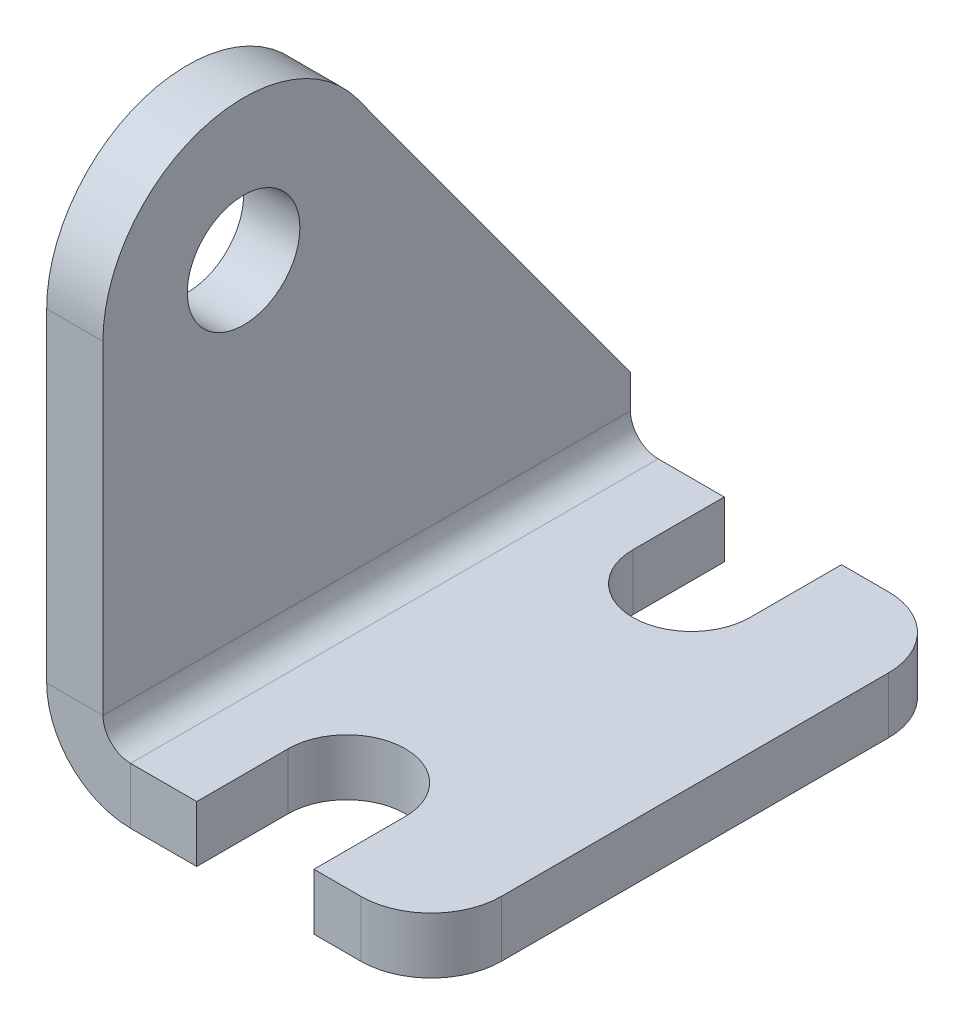
ISO-10303-21;
HEADER;
FILE_DESCRIPTION(('STEP AP214'),'2;1');
FILE_NAME('part.step','',(''),(''),'','','');
FILE_SCHEMA(('AUTOMOTIVE_DESIGN { 1 0 10303 214 1 1 1 1 }'));
ENDSEC;
DATA;
#1=APPLICATION_CONTEXT('core data for automotive mechanical design processes');
#2=APPLICATION_PROTOCOL_DEFINITION('international standard','automotive_design',2000,#1);
#3=PRODUCT_CONTEXT('',#1,'mechanical');
#4=PRODUCT('Part','Part','',(#3));
#5=PRODUCT_RELATED_PRODUCT_CATEGORY('part','',(#4));
#6=PRODUCT_DEFINITION_FORMATION('','',#4);
#7=PRODUCT_DEFINITION_CONTEXT('part definition',#1,'design');
#8=PRODUCT_DEFINITION('design','',#6,#7);
#9=PRODUCT_DEFINITION_SHAPE('','',#8);
#10=(LENGTH_UNIT() NAMED_UNIT(*) SI_UNIT(.MILLI.,.METRE.));
#11=(NAMED_UNIT(*) PLANE_ANGLE_UNIT() SI_UNIT($,.RADIAN.));
#12=(NAMED_UNIT(*) SI_UNIT($,.STERADIAN.) SOLID_ANGLE_UNIT());
#13=UNCERTAINTY_MEASURE_WITH_UNIT(LENGTH_MEASURE(1.E-05),#10,'distance_accuracy_value','');
#14=(GEOMETRIC_REPRESENTATION_CONTEXT(3) GLOBAL_UNCERTAINTY_ASSIGNED_CONTEXT((#13)) GLOBAL_UNIT_ASSIGNED_CONTEXT((#10,
#11,#12)) REPRESENTATION_CONTEXT('',''));
#15=CARTESIAN_POINT('',(0.,0.,0.));
#16=DIRECTION('',(0.,0.,1.));
#17=DIRECTION('',(1.,0.,0.));
#18=AXIS2_PLACEMENT_3D('',#15,#16,#17);
#19=CARTESIAN_POINT('',(3.048,0.,-28.575));
#20=DIRECTION('',(0.,0.,-1.));
#21=DIRECTION('',(-1.,0.,0.));
#22=AXIS2_PLACEMENT_3D('',#19,#20,#21);
#23=PLANE('',#22);
#24=DIRECTION('',(0.,-1.,0.));
#25=VECTOR('',#24,1.);
#26=CARTESIAN_POINT('',(4.548,0.,-28.575));
#27=LINE('',#26,#25);
#28=CARTESIAN_POINT('',(4.548,3.048,-28.575));
#29=VERTEX_POINT('',#28);
#30=CARTESIAN_POINT('',(4.548,0.,-28.575));
#31=VERTEX_POINT('',#30);
#32=EDGE_CURVE('E11',#29,#31,#27,.T.);
#33=ORIENTED_EDGE('',*,*,#32,.F.);
#34=DIRECTION('',(1.,0.,0.));
#35=VECTOR('',#34,1.);
#36=CARTESIAN_POINT('',(3.048,3.048,-28.575));
#37=LINE('',#36,#35);
#38=CARTESIAN_POINT('',(8.12799999999999,3.048,-28.575));
#39=VERTEX_POINT('',#38);
#40=EDGE_CURVE('E125',#39,#29,#37,.F.);
#41=ORIENTED_EDGE('',*,*,#40,.F.);
#42=DIRECTION('',(0.,-1.,0.));
#43=VECTOR('',#42,1.);
#44=CARTESIAN_POINT('',(8.128,0.,-28.575));
#45=LINE('',#44,#43);
#46=CARTESIAN_POINT('',(8.128,0.,-28.575));
#47=VERTEX_POINT('',#46);
#48=EDGE_CURVE('E53',#39,#47,#45,.T.);
#49=ORIENTED_EDGE('',*,*,#48,.T.);
#50=DIRECTION('',(-1.,0.,0.));
#51=VECTOR('',#50,1.);
#52=CARTESIAN_POINT('',(3.048,0.,-28.575));
#53=LINE('',#52,#51);
#54=EDGE_CURVE('E127',#47,#31,#53,.T.);
#55=ORIENTED_EDGE('',*,*,#54,.T.);
#56=EDGE_LOOP('',(#33,#41,#49,#55));
#57=FACE_BOUND('',#56,.T.);
#58=ADVANCED_FACE('F43',(#57),#23,.T.);
#59=CARTESIAN_POINT('',(8.128,0.,0.));
#60=DIRECTION('',(1.,0.,0.));
#61=DIRECTION('',(0.,0.,-1.));
#62=AXIS2_PLACEMENT_3D('',#59,#60,#61);
#63=PLANE('',#62);
#64=ORIENTED_EDGE('',*,*,#48,.F.);
#65=DIRECTION('',(0.,0.,1.));
#66=VECTOR('',#65,1.);
#67=CARTESIAN_POINT('',(8.12799999999999,3.048,0.));
#68=LINE('',#67,#66);
#69=CARTESIAN_POINT('',(8.12799999999999,3.048,-23.622));
#70=VERTEX_POINT('',#69);
#71=EDGE_CURVE('E152',#70,#39,#68,.F.);
#72=ORIENTED_EDGE('',*,*,#71,.F.);
#73=DIRECTION('',(0.,-1.,0.));
#74=VECTOR('',#73,1.);
#75=CARTESIAN_POINT('',(8.128,0.,-23.622));
#76=LINE('',#75,#74);
#77=CARTESIAN_POINT('',(8.128,0.,-23.622));
#78=VERTEX_POINT('',#77);
#79=EDGE_CURVE('E209',#70,#78,#76,.T.);
#80=ORIENTED_EDGE('',*,*,#79,.T.);
#81=DIRECTION('',(0.,0.,-1.));
#82=VECTOR('',#81,1.);
#83=CARTESIAN_POINT('',(8.128,0.,0.));
#84=LINE('',#83,#82);
#85=EDGE_CURVE('E223',#78,#47,#84,.T.);
#86=ORIENTED_EDGE('',*,*,#85,.T.);
#87=EDGE_LOOP('',(#64,#72,#80,#86));
#88=FACE_BOUND('',#87,.T.);
#89=ADVANCED_FACE('F230',(#88),#63,.T.);
#90=CARTESIAN_POINT('',(11.303,0.,-23.622));
#91=DIRECTION('',(0.,1.,0.));
#92=DIRECTION('',(0.,0.,1.));
#93=AXIS2_PLACEMENT_3D('',#90,#91,#92);
#94=CYLINDRICAL_SURFACE('',#93,3.175);
#95=ORIENTED_EDGE('',*,*,#79,.F.);
#96=CARTESIAN_POINT('',(11.303,3.048,-23.622));
#97=DIRECTION('',(0.,1.,0.));
#98=DIRECTION('',(0.,0.,1.));
#99=AXIS2_PLACEMENT_3D('',#96,#97,#98);
#100=CIRCLE('',#99,3.175);
#101=CARTESIAN_POINT('',(14.478,3.048,-23.622));
#102=VERTEX_POINT('',#101);
#103=EDGE_CURVE('E305',#70,#102,#100,.T.);
#104=ORIENTED_EDGE('',*,*,#103,.T.);
#105=DIRECTION('',(0.,-1.,0.));
#106=VECTOR('',#105,1.);
#107=CARTESIAN_POINT('',(14.478,0.,-23.622));
#108=LINE('',#107,#106);
#109=CARTESIAN_POINT('',(14.478,0.,-23.622));
#110=VERTEX_POINT('',#109);
#111=EDGE_CURVE('E206',#102,#110,#108,.T.);
#112=ORIENTED_EDGE('',*,*,#111,.T.);
#113=CARTESIAN_POINT('',(11.303,0.,-23.622));
#114=DIRECTION('',(0.,1.,0.));
#115=DIRECTION('',(0.,0.,1.));
#116=AXIS2_PLACEMENT_3D('',#113,#114,#115);
#117=CIRCLE('',#116,3.175);
#118=EDGE_CURVE('E231',#78,#110,#117,.T.);
#119=ORIENTED_EDGE('',*,*,#118,.F.);
#120=EDGE_LOOP('',(#95,#104,#112,#119));
#121=FACE_BOUND('',#120,.T.);
#122=ADVANCED_FACE('F308',(#121),#94,.F.);
#123=CARTESIAN_POINT('',(14.478,0.,0.));
#124=DIRECTION('',(1.,0.,0.));
#125=DIRECTION('',(0.,0.,-1.));
#126=AXIS2_PLACEMENT_3D('',#123,#124,#125);
#127=PLANE('',#126);
#128=ORIENTED_EDGE('',*,*,#111,.F.);
#129=DIRECTION('',(0.,0.,1.));
#130=VECTOR('',#129,1.);
#131=CARTESIAN_POINT('',(14.478,3.048,0.));
#132=LINE('',#131,#130);
#133=CARTESIAN_POINT('',(14.478,3.048,-28.575));
#134=VERTEX_POINT('',#133);
#135=EDGE_CURVE('E302',#102,#134,#132,.F.);
#136=ORIENTED_EDGE('',*,*,#135,.T.);
#137=DIRECTION('',(0.,-1.,0.));
#138=VECTOR('',#137,1.);
#139=CARTESIAN_POINT('',(14.478,0.,-28.575));
#140=LINE('',#139,#138);
#141=CARTESIAN_POINT('',(14.478,0.,-28.575));
#142=VERTEX_POINT('',#141);
#143=EDGE_CURVE('E203',#134,#142,#140,.T.);
#144=ORIENTED_EDGE('',*,*,#143,.T.);
#145=DIRECTION('',(0.,0.,-1.));
#146=VECTOR('',#145,1.);
#147=CARTESIAN_POINT('',(14.478,0.,0.));
#148=LINE('',#147,#146);
#149=EDGE_CURVE('E233',#110,#142,#148,.T.);
#150=ORIENTED_EDGE('',*,*,#149,.F.);
#151=EDGE_LOOP('',(#128,#136,#144,#150));
#152=FACE_BOUND('',#151,.T.);
#153=ADVANCED_FACE('F314',(#152),#127,.F.);
#154=ORIENTED_EDGE('',*,*,#143,.F.);
#155=DIRECTION('',(1.,0.,0.));
#156=VECTOR('',#155,1.);
#157=CARTESIAN_POINT('',(3.048,3.048,-28.575));
#158=LINE('',#157,#156);
#159=CARTESIAN_POINT('',(17.018,3.048,-28.575));
#160=VERTEX_POINT('',#159);
#161=EDGE_CURVE('E299',#160,#134,#158,.F.);
#162=ORIENTED_EDGE('',*,*,#161,.F.);
#163=DIRECTION('',(0.,-1.,0.));
#164=VECTOR('',#163,1.);
#165=CARTESIAN_POINT('',(17.018,0.,-28.575));
#166=LINE('',#165,#164);
#167=CARTESIAN_POINT('',(17.018,0.,-28.575));
#168=VERTEX_POINT('',#167);
#169=EDGE_CURVE('E200',#160,#168,#166,.T.);
#170=ORIENTED_EDGE('',*,*,#169,.T.);
#171=EDGE_CURVE('E229',#168,#142,#53,.T.);
#172=ORIENTED_EDGE('',*,*,#171,.T.);
#173=EDGE_LOOP('',(#154,#162,#170,#172));
#174=FACE_BOUND('',#173,.T.);
#175=ADVANCED_FACE('F324',(#174),#23,.T.);
#176=CARTESIAN_POINT('',(17.018,0.,-24.765));
#177=DIRECTION('',(0.,1.,0.));
#178=DIRECTION('',(0.,0.,1.));
#179=AXIS2_PLACEMENT_3D('',#176,#177,#178);
#180=CYLINDRICAL_SURFACE('',#179,3.81);
#181=ORIENTED_EDGE('',*,*,#169,.F.);
#182=CARTESIAN_POINT('',(17.018,3.048,-24.765));
#183=DIRECTION('',(0.,1.,0.));
#184=DIRECTION('',(0.,0.,1.));
#185=AXIS2_PLACEMENT_3D('',#182,#183,#184);
#186=CIRCLE('',#185,3.81);
#187=CARTESIAN_POINT('',(20.828,3.048,-24.765));
#188=VERTEX_POINT('',#187);
#189=EDGE_CURVE('E277',#160,#188,#186,.F.);
#190=ORIENTED_EDGE('',*,*,#189,.T.);
#191=DIRECTION('',(0.,-1.,0.));
#192=VECTOR('',#191,1.);
#193=CARTESIAN_POINT('',(20.828,0.,-24.765));
#194=LINE('',#193,#192);
#195=CARTESIAN_POINT('',(20.828,0.,-24.765));
#196=VERTEX_POINT('',#195);
#197=EDGE_CURVE('E197',#188,#196,#194,.T.);
#198=ORIENTED_EDGE('',*,*,#197,.T.);
#199=CARTESIAN_POINT('',(17.018,0.,-24.765));
#200=DIRECTION('',(0.,1.,0.));
#201=DIRECTION('',(0.,0.,1.));
#202=AXIS2_PLACEMENT_3D('',#199,#200,#201);
#203=CIRCLE('',#202,3.81);
#204=EDGE_CURVE('E239',#168,#196,#203,.F.);
#205=ORIENTED_EDGE('',*,*,#204,.F.);
#206=EDGE_LOOP('',(#181,#190,#198,#205));
#207=FACE_BOUND('',#206,.T.);
#208=ADVANCED_FACE('F328',(#207),#180,.T.);
#209=CARTESIAN_POINT('',(20.828,0.,0.));
#210=DIRECTION('',(1.,0.,0.));
#211=DIRECTION('',(0.,0.,-1.));
#212=AXIS2_PLACEMENT_3D('',#209,#210,#211);
#213=PLANE('',#212);
#214=ORIENTED_EDGE('',*,*,#197,.F.);
#215=DIRECTION('',(0.,0.,1.));
#216=VECTOR('',#215,1.);
#217=CARTESIAN_POINT('',(20.828,3.048,0.));
#218=LINE('',#217,#216);
#219=CARTESIAN_POINT('',(20.828,3.048,-3.81));
#220=VERTEX_POINT('',#219);
#221=EDGE_CURVE('E158',#220,#188,#218,.F.);
#222=ORIENTED_EDGE('',*,*,#221,.F.);
#223=DIRECTION('',(0.,-1.,0.));
#224=VECTOR('',#223,1.);
#225=CARTESIAN_POINT('',(20.828,0.,-3.81));
#226=LINE('',#225,#224);
#227=CARTESIAN_POINT('',(20.828,0.,-3.81));
#228=VERTEX_POINT('',#227);
#229=EDGE_CURVE('E194',#220,#228,#226,.T.);
#230=ORIENTED_EDGE('',*,*,#229,.T.);
#231=DIRECTION('',(0.,0.,-1.));
#232=VECTOR('',#231,1.);
#233=CARTESIAN_POINT('',(20.828,0.,0.));
#234=LINE('',#233,#232);
#235=EDGE_CURVE('E265',#228,#196,#234,.T.);
#236=ORIENTED_EDGE('',*,*,#235,.T.);
#237=EDGE_LOOP('',(#214,#222,#230,#236));
#238=FACE_BOUND('',#237,.T.);
#239=ADVANCED_FACE('F333',(#238),#213,.T.);
#240=CARTESIAN_POINT('',(17.018,0.,-3.81));
#241=DIRECTION('',(0.,1.,0.));
#242=DIRECTION('',(0.,0.,1.));
#243=AXIS2_PLACEMENT_3D('',#240,#241,#242);
#244=CYLINDRICAL_SURFACE('',#243,3.81);
#245=ORIENTED_EDGE('',*,*,#229,.F.);
#246=CARTESIAN_POINT('',(17.018,3.048,-3.81));
#247=DIRECTION('',(0.,1.,0.));
#248=DIRECTION('',(0.,0.,1.));
#249=AXIS2_PLACEMENT_3D('',#246,#247,#248);
#250=CIRCLE('',#249,3.81);
#251=CARTESIAN_POINT('',(17.018,3.048,0.));
#252=VERTEX_POINT('',#251);
#253=EDGE_CURVE('E292',#220,#252,#250,.F.);
#254=ORIENTED_EDGE('',*,*,#253,.T.);
#255=DIRECTION('',(0.,-1.,0.));
#256=VECTOR('',#255,1.);
#257=CARTESIAN_POINT('',(17.018,0.,0.));
#258=LINE('',#257,#256);
#259=CARTESIAN_POINT('',(17.018,0.,0.));
#260=VERTEX_POINT('',#259);
#261=EDGE_CURVE('E191',#252,#260,#258,.T.);
#262=ORIENTED_EDGE('',*,*,#261,.T.);
#263=CARTESIAN_POINT('',(17.018,0.,-3.81));
#264=DIRECTION('',(0.,1.,0.));
#265=DIRECTION('',(0.,0.,1.));
#266=AXIS2_PLACEMENT_3D('',#263,#264,#265);
#267=CIRCLE('',#266,3.81);
#268=EDGE_CURVE('E343',#228,#260,#267,.F.);
#269=ORIENTED_EDGE('',*,*,#268,.F.);
#270=EDGE_LOOP('',(#245,#254,#262,#269));
#271=FACE_BOUND('',#270,.T.);
#272=ADVANCED_FACE('F348',(#271),#244,.T.);
#273=CARTESIAN_POINT('',(3.048,0.,0.));
#274=DIRECTION('',(0.,0.,-1.));
#275=DIRECTION('',(-1.,0.,0.));
#276=AXIS2_PLACEMENT_3D('',#273,#274,#275);
#277=PLANE('',#276);
#278=ORIENTED_EDGE('',*,*,#261,.F.);
#279=DIRECTION('',(1.,0.,0.));
#280=VECTOR('',#279,1.);
#281=CARTESIAN_POINT('',(3.048,3.048,0.));
#282=LINE('',#281,#280);
#283=CARTESIAN_POINT('',(14.478,3.048,0.));
#284=VERTEX_POINT('',#283);
#285=EDGE_CURVE('E289',#252,#284,#282,.F.);
#286=ORIENTED_EDGE('',*,*,#285,.T.);
#287=DIRECTION('',(0.,-1.,0.));
#288=VECTOR('',#287,1.);
#289=CARTESIAN_POINT('',(14.478,0.,0.));
#290=LINE('',#289,#288);
#291=CARTESIAN_POINT('',(14.478,0.,0.));
#292=VERTEX_POINT('',#291);
#293=EDGE_CURVE('E188',#284,#292,#290,.T.);
#294=ORIENTED_EDGE('',*,*,#293,.T.);
#295=DIRECTION('',(-1.,0.,0.));
#296=VECTOR('',#295,1.);
#297=CARTESIAN_POINT('',(3.048,0.,0.));
#298=LINE('',#297,#296);
#299=EDGE_CURVE('E349',#260,#292,#298,.T.);
#300=ORIENTED_EDGE('',*,*,#299,.F.);
#301=EDGE_LOOP('',(#278,#286,#294,#300));
#302=FACE_BOUND('',#301,.T.);
#303=ADVANCED_FACE('F398',(#302),#277,.F.);
#304=CARTESIAN_POINT('',(14.478,0.,0.));
#305=DIRECTION('',(1.,0.,0.));
#306=DIRECTION('',(0.,0.,-1.));
#307=AXIS2_PLACEMENT_3D('',#304,#305,#306);
#308=PLANE('',#307);
#309=ORIENTED_EDGE('',*,*,#293,.F.);
#310=DIRECTION('',(0.,0.,1.));
#311=VECTOR('',#310,1.);
#312=CARTESIAN_POINT('',(14.478,3.048,0.));
#313=LINE('',#312,#311);
#314=CARTESIAN_POINT('',(14.478,3.048,-4.953));
#315=VERTEX_POINT('',#314);
#316=EDGE_CURVE('E286',#284,#315,#313,.F.);
#317=ORIENTED_EDGE('',*,*,#316,.T.);
#318=DIRECTION('',(0.,-1.,0.));
#319=VECTOR('',#318,1.);
#320=CARTESIAN_POINT('',(14.478,0.,-4.953));
#321=LINE('',#320,#319);
#322=CARTESIAN_POINT('',(14.478,0.,-4.953));
#323=VERTEX_POINT('',#322);
#324=EDGE_CURVE('E185',#315,#323,#321,.T.);
#325=ORIENTED_EDGE('',*,*,#324,.T.);
#326=DIRECTION('',(0.,0.,-1.));
#327=VECTOR('',#326,1.);
#328=CARTESIAN_POINT('',(14.478,0.,0.));
#329=LINE('',#328,#327);
#330=EDGE_CURVE('E351',#292,#323,#329,.T.);
#331=ORIENTED_EDGE('',*,*,#330,.F.);
#332=EDGE_LOOP('',(#309,#317,#325,#331));
#333=FACE_BOUND('',#332,.T.);
#334=ADVANCED_FACE('F402',(#333),#308,.F.);
#335=CARTESIAN_POINT('',(11.303,0.,-4.953));
#336=DIRECTION('',(0.,1.,0.));
#337=DIRECTION('',(0.,0.,1.));
#338=AXIS2_PLACEMENT_3D('',#335,#336,#337);
#339=CYLINDRICAL_SURFACE('',#338,3.175);
#340=ORIENTED_EDGE('',*,*,#324,.F.);
#341=CARTESIAN_POINT('',(11.303,3.048,-4.953));
#342=DIRECTION('',(0.,1.,0.));
#343=DIRECTION('',(0.,0.,1.));
#344=AXIS2_PLACEMENT_3D('',#341,#342,#343);
#345=CIRCLE('',#344,3.175);
#346=CARTESIAN_POINT('',(8.12799999999999,3.048,-4.953));
#347=VERTEX_POINT('',#346);
#348=EDGE_CURVE('E283',#347,#315,#345,.F.);
#349=ORIENTED_EDGE('',*,*,#348,.F.);
#350=DIRECTION('',(0.,-1.,0.));
#351=VECTOR('',#350,1.);
#352=CARTESIAN_POINT('',(8.128,0.,-4.953));
#353=LINE('',#352,#351);
#354=CARTESIAN_POINT('',(8.128,0.,-4.953));
#355=VERTEX_POINT('',#354);
#356=EDGE_CURVE('E182',#347,#355,#353,.T.);
#357=ORIENTED_EDGE('',*,*,#356,.T.);
#358=CARTESIAN_POINT('',(11.303,0.,-4.953));
#359=DIRECTION('',(0.,1.,0.));
#360=DIRECTION('',(0.,0.,1.));
#361=AXIS2_PLACEMENT_3D('',#358,#359,#360);
#362=CIRCLE('',#361,3.175);
#363=EDGE_CURVE('E356',#355,#323,#362,.F.);
#364=ORIENTED_EDGE('',*,*,#363,.T.);
#365=EDGE_LOOP('',(#340,#349,#357,#364));
#366=FACE_BOUND('',#365,.T.);
#367=ADVANCED_FACE('F405',(#366),#339,.F.);
#368=CARTESIAN_POINT('',(8.128,0.,0.));
#369=DIRECTION('',(1.,0.,0.));
#370=DIRECTION('',(0.,0.,-1.));
#371=AXIS2_PLACEMENT_3D('',#368,#369,#370);
#372=PLANE('',#371);
#373=ORIENTED_EDGE('',*,*,#356,.F.);
#374=DIRECTION('',(0.,0.,1.));
#375=VECTOR('',#374,1.);
#376=CARTESIAN_POINT('',(8.12799999999999,3.048,0.));
#377=LINE('',#376,#375);
#378=CARTESIAN_POINT('',(8.12799999999999,3.048,0.));
#379=VERTEX_POINT('',#378);
#380=EDGE_CURVE('E280',#379,#347,#377,.F.);
#381=ORIENTED_EDGE('',*,*,#380,.F.);
#382=DIRECTION('',(0.,-1.,0.));
#383=VECTOR('',#382,1.);
#384=CARTESIAN_POINT('',(8.128,0.,0.));
#385=LINE('',#384,#383);
#386=CARTESIAN_POINT('',(8.128,0.,0.));
#387=VERTEX_POINT('',#386);
#388=EDGE_CURVE('E179',#379,#387,#385,.T.);
#389=ORIENTED_EDGE('',*,*,#388,.T.);
#390=DIRECTION('',(0.,0.,-1.));
#391=VECTOR('',#390,1.);
#392=CARTESIAN_POINT('',(8.128,0.,0.));
#393=LINE('',#392,#391);
#394=EDGE_CURVE('E358',#387,#355,#393,.T.);
#395=ORIENTED_EDGE('',*,*,#394,.T.);
#396=EDGE_LOOP('',(#373,#381,#389,#395));
#397=FACE_BOUND('',#396,.T.);
#398=ADVANCED_FACE('F407',(#397),#372,.T.);
#399=ORIENTED_EDGE('',*,*,#388,.F.);
#400=DIRECTION('',(1.,0.,0.));
#401=VECTOR('',#400,1.);
#402=CARTESIAN_POINT('',(3.048,3.048,0.));
#403=LINE('',#402,#401);
#404=CARTESIAN_POINT('',(4.548,3.048,0.));
#405=VERTEX_POINT('',#404);
#406=EDGE_CURVE('E153',#379,#405,#403,.F.);
#407=ORIENTED_EDGE('',*,*,#406,.T.);
#408=DIRECTION('',(0.,-1.,0.));
#409=VECTOR('',#408,1.);
#410=CARTESIAN_POINT('',(4.548,0.,0.));
#411=LINE('',#410,#409);
#412=CARTESIAN_POINT('',(4.548,0.,0.));
#413=VERTEX_POINT('',#412);
#414=EDGE_CURVE('E176',#405,#413,#411,.T.);
#415=ORIENTED_EDGE('',*,*,#414,.T.);
#416=EDGE_CURVE('E227',#387,#413,#298,.T.);
#417=ORIENTED_EDGE('',*,*,#416,.F.);
#418=EDGE_LOOP('',(#399,#407,#415,#417));
#419=FACE_BOUND('',#418,.T.);
#420=ADVANCED_FACE('F408',(#419),#277,.F.);
#421=CARTESIAN_POINT('',(4.548,4.548,0.));
#422=DIRECTION('',(0.,0.,1.));
#423=DIRECTION('',(1.,0.,0.));
#424=AXIS2_PLACEMENT_3D('',#421,#422,#423);
#425=PLANE('',#424);
#426=ORIENTED_EDGE('',*,*,#414,.F.);
#427=CARTESIAN_POINT('',(4.548,4.548,0.));
#428=DIRECTION('',(0.,0.,-1.));
#429=DIRECTION('',(-1.,0.,0.));
#430=AXIS2_PLACEMENT_3D('',#427,#428,#429);
#431=CIRCLE('',#430,1.5);
#432=CARTESIAN_POINT('',(3.048,4.548,0.));
#433=VERTEX_POINT('',#432);
#434=EDGE_CURVE('E141',#405,#433,#431,.T.);
#435=ORIENTED_EDGE('',*,*,#434,.T.);
#436=DIRECTION('',(-1.,0.,0.));
#437=VECTOR('',#436,1.);
#438=CARTESIAN_POINT('',(0.,4.548,0.));
#439=LINE('',#438,#437);
#440=CARTESIAN_POINT('',(0.,4.548,0.));
#441=VERTEX_POINT('',#440);
#442=EDGE_CURVE('E174',#433,#441,#439,.T.);
#443=ORIENTED_EDGE('',*,*,#442,.T.);
#444=CARTESIAN_POINT('',(4.548,4.548,0.));
#445=DIRECTION('',(0.,0.,-1.));
#446=DIRECTION('',(-1.,0.,0.));
#447=AXIS2_PLACEMENT_3D('',#444,#445,#446);
#448=CIRCLE('',#447,4.548);
#449=EDGE_CURVE('E262',#413,#441,#448,.T.);
#450=ORIENTED_EDGE('',*,*,#449,.F.);
#451=EDGE_LOOP('',(#426,#435,#443,#450));
#452=FACE_BOUND('',#451,.T.);
#453=ADVANCED_FACE('F371',(#452),#425,.T.);
#454=CARTESIAN_POINT('',(0.,0.,0.));
#455=DIRECTION('',(0.,0.,1.));
#456=DIRECTION('',(0.,-1.,0.));
#457=AXIS2_PLACEMENT_3D('',#454,#455,#456);
#458=PLANE('',#457);
#459=ORIENTED_EDGE('',*,*,#442,.F.);
#460=DIRECTION('',(0.,1.,0.));
#461=VECTOR('',#460,1.);
#462=CARTESIAN_POINT('',(3.048,22.098,0.));
#463=LINE('',#462,#461);
#464=CARTESIAN_POINT('',(3.048,22.098,0.));
#465=VERTEX_POINT('',#464);
#466=EDGE_CURVE('E275',#465,#433,#463,.F.);
#467=ORIENTED_EDGE('',*,*,#466,.F.);
#468=DIRECTION('',(-1.,0.,0.));
#469=VECTOR('',#468,1.);
#470=CARTESIAN_POINT('',(0.,22.098,0.));
#471=LINE('',#470,#469);
#472=CARTESIAN_POINT('',(0.,22.098,0.));
#473=VERTEX_POINT('',#472);
#474=EDGE_CURVE('E171',#465,#473,#471,.T.);
#475=ORIENTED_EDGE('',*,*,#474,.T.);
#476=DIRECTION('',(0.,-1.,0.));
#477=VECTOR('',#476,1.);
#478=CARTESIAN_POINT('',(0.,0.,0.));
#479=LINE('',#478,#477);
#480=EDGE_CURVE('E242',#473,#441,#479,.T.);
#481=ORIENTED_EDGE('',*,*,#480,.T.);
#482=EDGE_LOOP('',(#459,#467,#475,#481));
#483=FACE_BOUND('',#482,.T.);
#484=ADVANCED_FACE('F415',(#483),#458,.T.);
#485=CARTESIAN_POINT('',(0.,22.098,-7.62));
#486=DIRECTION('',(1.,0.,0.));
#487=DIRECTION('',(0.,0.,-1.));
#488=AXIS2_PLACEMENT_3D('',#485,#486,#487);
#489=CYLINDRICAL_SURFACE('',#488,7.62);
#490=ORIENTED_EDGE('',*,*,#474,.F.);
#491=CARTESIAN_POINT('',(3.048,22.098,-7.62));
#492=DIRECTION('',(1.,0.,0.));
#493=DIRECTION('',(0.,0.,-1.));
#494=AXIS2_PLACEMENT_3D('',#491,#492,#493);
#495=CIRCLE('',#494,7.62);
#496=CARTESIAN_POINT('',(3.048,26.5957169195159,-13.7710115031513));
#497=VERTEX_POINT('',#496);
#498=EDGE_CURVE('E272',#497,#465,#495,.T.);
#499=ORIENTED_EDGE('',*,*,#498,.F.);
#500=DIRECTION('',(-1.,0.,0.));
#501=VECTOR('',#500,1.);
#502=CARTESIAN_POINT('',(0.,26.5957169195159,-13.7710115031513));
#503=LINE('',#502,#501);
#504=CARTESIAN_POINT('',(0.,26.5957169195159,-13.7710115031513));
#505=VERTEX_POINT('',#504);
#506=EDGE_CURVE('E168',#497,#505,#503,.T.);
#507=ORIENTED_EDGE('',*,*,#506,.T.);
#508=CARTESIAN_POINT('',(0.,22.098,-7.62));
#509=DIRECTION('',(1.,0.,0.));
#510=DIRECTION('',(0.,0.,-1.));
#511=AXIS2_PLACEMENT_3D('',#508,#509,#510);
#512=CIRCLE('',#511,7.62);
#513=EDGE_CURVE('E245',#505,#473,#512,.T.);
#514=ORIENTED_EDGE('',*,*,#513,.T.);
#515=EDGE_LOOP('',(#490,#499,#507,#514));
#516=FACE_BOUND('',#515,.T.);
#517=ADVANCED_FACE('F447',(#516),#489,.T.);
#518=CARTESIAN_POINT('',(0.,6.35,-28.575));
#519=DIRECTION('',(0.,0.590251564240934,-0.807219357368944));
#520=DIRECTION('',(0.,0.807219357368944,0.590251564240934));
#521=AXIS2_PLACEMENT_3D('',#518,#519,#520);
#522=PLANE('',#521);
#523=ORIENTED_EDGE('',*,*,#506,.F.);
#524=DIRECTION('',(0.,0.807219357368944,0.590251564240934));
#525=VECTOR('',#524,1.);
#526=CARTESIAN_POINT('',(3.048,6.35,-28.575));
#527=LINE('',#526,#525);
#528=CARTESIAN_POINT('',(3.048,6.35,-28.575));
#529=VERTEX_POINT('',#528);
#530=EDGE_CURVE('E269',#529,#497,#527,.T.);
#531=ORIENTED_EDGE('',*,*,#530,.F.);
#532=DIRECTION('',(-1.,0.,0.));
#533=VECTOR('',#532,1.);
#534=CARTESIAN_POINT('',(0.,6.35,-28.575));
#535=LINE('',#534,#533);
#536=CARTESIAN_POINT('',(0.,6.35,-28.575));
#537=VERTEX_POINT('',#536);
#538=EDGE_CURVE('E165',#529,#537,#535,.T.);
#539=ORIENTED_EDGE('',*,*,#538,.T.);
#540=DIRECTION('',(0.,0.807219357368944,0.590251564240934));
#541=VECTOR('',#540,1.);
#542=CARTESIAN_POINT('',(0.,6.35,-28.575));
#543=LINE('',#542,#541);
#544=EDGE_CURVE('E248',#537,#505,#543,.T.);
#545=ORIENTED_EDGE('',*,*,#544,.T.);
#546=EDGE_LOOP('',(#523,#531,#539,#545));
#547=FACE_BOUND('',#546,.T.);
#548=ADVANCED_FACE('F442',(#547),#522,.T.);
#549=CARTESIAN_POINT('',(0.,0.,-28.575));
#550=DIRECTION('',(0.,0.,-1.));
#551=DIRECTION('',(0.,1.,0.));
#552=AXIS2_PLACEMENT_3D('',#549,#550,#551);
#553=PLANE('',#552);
#554=ORIENTED_EDGE('',*,*,#538,.F.);
#555=DIRECTION('',(0.,1.,0.));
#556=VECTOR('',#555,1.);
#557=CARTESIAN_POINT('',(3.048,22.098,-28.575));
#558=LINE('',#557,#556);
#559=CARTESIAN_POINT('',(3.048,4.548,-28.575));
#560=VERTEX_POINT('',#559);
#561=EDGE_CURVE('E164',#560,#529,#558,.T.);
#562=ORIENTED_EDGE('',*,*,#561,.F.);
#563=DIRECTION('',(-1.,0.,0.));
#564=VECTOR('',#563,1.);
#565=CARTESIAN_POINT('',(0.,4.548,-28.575));
#566=LINE('',#565,#564);
#567=CARTESIAN_POINT('',(0.,4.548,-28.575));
#568=VERTEX_POINT('',#567);
#569=EDGE_CURVE('E47',#560,#568,#566,.T.);
#570=ORIENTED_EDGE('',*,*,#569,.T.);
#571=DIRECTION('',(0.,1.,0.));
#572=VECTOR('',#571,1.);
#573=CARTESIAN_POINT('',(0.,0.,-28.575));
#574=LINE('',#573,#572);
#575=EDGE_CURVE('E251',#568,#537,#574,.T.);
#576=ORIENTED_EDGE('',*,*,#575,.T.);
#577=EDGE_LOOP('',(#554,#562,#570,#576));
#578=FACE_BOUND('',#577,.T.);
#579=ADVANCED_FACE('F382',(#578),#553,.T.);
#580=CARTESIAN_POINT('',(4.548,4.548,-28.575));
#581=DIRECTION('',(0.,0.,1.));
#582=DIRECTION('',(1.,0.,0.));
#583=AXIS2_PLACEMENT_3D('',#580,#581,#582);
#584=PLANE('',#583);
#585=CARTESIAN_POINT('',(4.548,4.548,-28.575));
#586=DIRECTION('',(0.,0.,-1.));
#587=DIRECTION('',(-1.,0.,0.));
#588=AXIS2_PLACEMENT_3D('',#585,#586,#587);
#589=CIRCLE('',#588,1.5);
#590=EDGE_CURVE('E139',#560,#29,#589,.F.);
#591=ORIENTED_EDGE('',*,*,#590,.T.);
#592=ORIENTED_EDGE('',*,*,#32,.T.);
#593=CARTESIAN_POINT('',(4.548,4.548,-28.575));
#594=DIRECTION('',(0.,0.,-1.));
#595=DIRECTION('',(-1.,0.,0.));
#596=AXIS2_PLACEMENT_3D('',#593,#594,#595);
#597=CIRCLE('',#596,4.548);
#598=EDGE_CURVE('E260',#568,#31,#597,.F.);
#599=ORIENTED_EDGE('',*,*,#598,.F.);
#600=ORIENTED_EDGE('',*,*,#569,.F.);
#601=EDGE_LOOP('',(#591,#592,#599,#600));
#602=FACE_BOUND('',#601,.T.);
#603=ADVANCED_FACE('F155',(#602),#584,.F.);
#604=CARTESIAN_POINT('',(0.,22.098,-7.62));
#605=DIRECTION('',(1.,0.,0.));
#606=DIRECTION('',(0.,0.,-1.));
#607=AXIS2_PLACEMENT_3D('',#604,#605,#606);
#608=CYLINDRICAL_SURFACE('',#607,3.048);
#609=CARTESIAN_POINT('',(0.,22.098,-7.62));
#610=DIRECTION('',(1.,0.,0.));
#611=DIRECTION('',(0.,0.,-1.));
#612=AXIS2_PLACEMENT_3D('',#609,#610,#611);
#613=CIRCLE('',#612,3.048);
#614=CARTESIAN_POINT('',(0.,22.098,-10.668));
#615=VERTEX_POINT('',#614);
#616=EDGE_CURVE('E253',#615,#615,#613,.T.);
#617=ORIENTED_EDGE('',*,*,#616,.F.);
#618=EDGE_LOOP('',(#617));
#619=FACE_BOUND('',#618,.T.);
#620=CARTESIAN_POINT('',(3.048,22.098,-7.62));
#621=DIRECTION('',(1.,0.,0.));
#622=DIRECTION('',(0.,0.,-1.));
#623=AXIS2_PLACEMENT_3D('',#620,#621,#622);
#624=CIRCLE('',#623,3.048);
#625=CARTESIAN_POINT('',(3.048,22.098,-10.668));
#626=VERTEX_POINT('',#625);
#627=EDGE_CURVE('E146',#626,#626,#624,.T.);
#628=ORIENTED_EDGE('',*,*,#627,.T.);
#629=EDGE_LOOP('',(#628));
#630=FACE_BOUND('',#629,.T.);
#631=ADVANCED_FACE('F45',(#619,#630),#608,.F.);
#632=CARTESIAN_POINT('',(0.,22.098,-7.62));
#633=DIRECTION('',(1.,0.,0.));
#634=DIRECTION('',(0.,0.,-1.));
#635=AXIS2_PLACEMENT_3D('',#632,#633,#634);
#636=PLANE('',#635);
#637=ORIENTED_EDGE('',*,*,#575,.F.);
#638=DIRECTION('',(0.,0.,-1.));
#639=VECTOR('',#638,1.);
#640=CARTESIAN_POINT('',(0.,4.548,-7.62));
#641=LINE('',#640,#639);
#642=EDGE_CURVE('E257',#568,#441,#641,.F.);
#643=ORIENTED_EDGE('',*,*,#642,.T.);
#644=ORIENTED_EDGE('',*,*,#480,.F.);
#645=ORIENTED_EDGE('',*,*,#513,.F.);
#646=ORIENTED_EDGE('',*,*,#544,.F.);
#647=EDGE_LOOP('',(#637,#643,#644,#645,#646));
#648=FACE_BOUND('',#647,.T.);
#649=ORIENTED_EDGE('',*,*,#616,.T.);
#650=EDGE_LOOP('',(#649));
#651=FACE_BOUND('',#650,.T.);
#652=ADVANCED_FACE('F378',(#648,#651),#636,.F.);
#653=CARTESIAN_POINT('',(3.048,0.,0.));
#654=DIRECTION('',(0.,1.,0.));
#655=DIRECTION('',(0.,0.,1.));
#656=AXIS2_PLACEMENT_3D('',#653,#654,#655);
#657=PLANE('',#656);
#658=ORIENTED_EDGE('',*,*,#416,.T.);
#659=DIRECTION('',(0.,0.,-1.));
#660=VECTOR('',#659,1.);
#661=CARTESIAN_POINT('',(4.548,0.,0.));
#662=LINE('',#661,#660);
#663=EDGE_CURVE('E226',#413,#31,#662,.T.);
#664=ORIENTED_EDGE('',*,*,#663,.T.);
#665=ORIENTED_EDGE('',*,*,#54,.F.);
#666=ORIENTED_EDGE('',*,*,#85,.F.);
#667=ORIENTED_EDGE('',*,*,#118,.T.);
#668=ORIENTED_EDGE('',*,*,#149,.T.);
#669=ORIENTED_EDGE('',*,*,#171,.F.);
#670=ORIENTED_EDGE('',*,*,#204,.T.);
#671=ORIENTED_EDGE('',*,*,#235,.F.);
#672=ORIENTED_EDGE('',*,*,#268,.T.);
#673=ORIENTED_EDGE('',*,*,#299,.T.);
#674=ORIENTED_EDGE('',*,*,#330,.T.);
#675=ORIENTED_EDGE('',*,*,#363,.F.);
#676=ORIENTED_EDGE('',*,*,#394,.F.);
#677=EDGE_LOOP('',(#658,#664,#665,#666,#667,#668,#669,#670,#671,#672,#673,#674,#675,#676));
#678=FACE_BOUND('',#677,.T.);
#679=ADVANCED_FACE('F221',(#678),#657,.F.);
#680=CARTESIAN_POINT('',(4.548,4.548,0.));
#681=DIRECTION('',(0.,0.,-1.));
#682=DIRECTION('',(-1.,0.,0.));
#683=AXIS2_PLACEMENT_3D('',#680,#681,#682);
#684=CYLINDRICAL_SURFACE('',#683,4.548);
#685=ORIENTED_EDGE('',*,*,#449,.T.);
#686=ORIENTED_EDGE('',*,*,#642,.F.);
#687=ORIENTED_EDGE('',*,*,#598,.T.);
#688=ORIENTED_EDGE('',*,*,#663,.F.);
#689=EDGE_LOOP('',(#685,#686,#687,#688));
#690=FACE_BOUND('',#689,.T.);
#691=ADVANCED_FACE('F374',(#690),#684,.T.);
#692=CARTESIAN_POINT('',(3.048,22.098,-7.62));
#693=DIRECTION('',(1.,0.,0.));
#694=DIRECTION('',(0.,0.,-1.));
#695=AXIS2_PLACEMENT_3D('',#692,#693,#694);
#696=PLANE('',#695);
#697=ORIENTED_EDGE('',*,*,#561,.T.);
#698=ORIENTED_EDGE('',*,*,#530,.T.);
#699=ORIENTED_EDGE('',*,*,#498,.T.);
#700=ORIENTED_EDGE('',*,*,#466,.T.);
#701=DIRECTION('',(0.,0.,-1.));
#702=VECTOR('',#701,1.);
#703=CARTESIAN_POINT('',(3.048,4.548,-7.62));
#704=LINE('',#703,#702);
#705=EDGE_CURVE('E145',#560,#433,#704,.F.);
#706=ORIENTED_EDGE('',*,*,#705,.F.);
#707=EDGE_LOOP('',(#697,#698,#699,#700,#706));
#708=FACE_BOUND('',#707,.T.);
#709=ORIENTED_EDGE('',*,*,#627,.F.);
#710=EDGE_LOOP('',(#709));
#711=FACE_BOUND('',#710,.T.);
#712=ADVANCED_FACE('F461',(#708,#711),#696,.T.);
#713=CARTESIAN_POINT('',(3.048,3.048,0.));
#714=DIRECTION('',(0.,1.,0.));
#715=DIRECTION('',(0.,0.,1.));
#716=AXIS2_PLACEMENT_3D('',#713,#714,#715);
#717=PLANE('',#716);
#718=ORIENTED_EDGE('',*,*,#406,.F.);
#719=ORIENTED_EDGE('',*,*,#380,.T.);
#720=ORIENTED_EDGE('',*,*,#348,.T.);
#721=ORIENTED_EDGE('',*,*,#316,.F.);
#722=ORIENTED_EDGE('',*,*,#285,.F.);
#723=ORIENTED_EDGE('',*,*,#253,.F.);
#724=ORIENTED_EDGE('',*,*,#221,.T.);
#725=ORIENTED_EDGE('',*,*,#189,.F.);
#726=ORIENTED_EDGE('',*,*,#161,.T.);
#727=ORIENTED_EDGE('',*,*,#135,.F.);
#728=ORIENTED_EDGE('',*,*,#103,.F.);
#729=ORIENTED_EDGE('',*,*,#71,.T.);
#730=ORIENTED_EDGE('',*,*,#40,.T.);
#731=DIRECTION('',(0.,0.,1.));
#732=VECTOR('',#731,1.);
#733=CARTESIAN_POINT('',(4.548,3.048,0.));
#734=LINE('',#733,#732);
#735=EDGE_CURVE('E136',#405,#29,#734,.F.);
#736=ORIENTED_EDGE('',*,*,#735,.F.);
#737=EDGE_LOOP('',(#718,#719,#720,#721,#722,#723,#724,#725,#726,#727,#728,#729,#730,#736));
#738=FACE_BOUND('',#737,.T.);
#739=ADVANCED_FACE('F149',(#738),#717,.T.);
#740=CARTESIAN_POINT('',(4.548,4.548,0.));
#741=DIRECTION('',(0.,0.,-1.));
#742=DIRECTION('',(-1.,0.,0.));
#743=AXIS2_PLACEMENT_3D('',#740,#741,#742);
#744=CYLINDRICAL_SURFACE('',#743,1.5);
#745=ORIENTED_EDGE('',*,*,#434,.F.);
#746=ORIENTED_EDGE('',*,*,#735,.T.);
#747=ORIENTED_EDGE('',*,*,#590,.F.);
#748=ORIENTED_EDGE('',*,*,#705,.T.);
#749=EDGE_LOOP('',(#745,#746,#747,#748));
#750=FACE_BOUND('',#749,.T.);
#751=ADVANCED_FACE('F137',(#750),#744,.F.);
#752=CLOSED_SHELL('',(#58,#89,#122,#153,#175,#208,#239,#272,#303,#334,#367,#398,#420,#453,#484,
#517,#548,#579,#603,#631,#652,#679,#691,#712,#739,#751));
#753=MANIFOLD_SOLID_BREP('B2',#752);
#754=ADVANCED_BREP_SHAPE_REPRESENTATION('',(#18,#753),#14);
#755=SHAPE_DEFINITION_REPRESENTATION(#9,#754);
ENDSEC;
END-ISO-10303-21;
